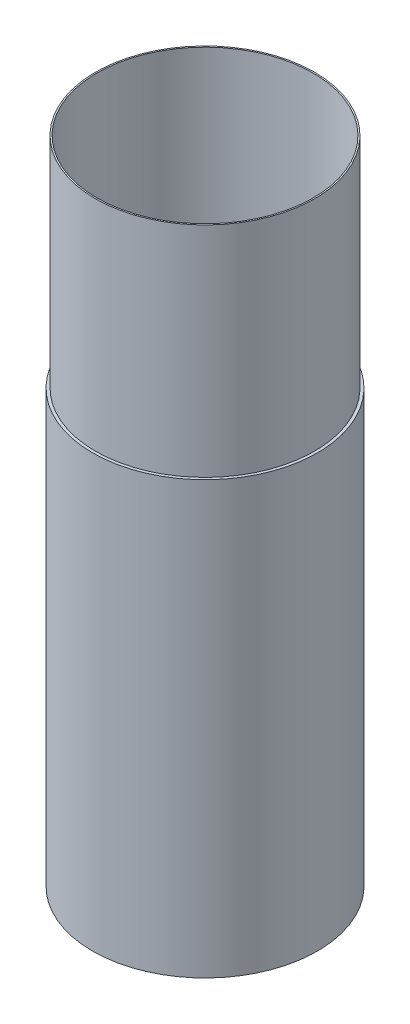
ISO-10303-21;
HEADER;
FILE_DESCRIPTION(('STEP AP214'),'2;1');
FILE_NAME('part.step','',(''),(''),'','','');
FILE_SCHEMA(('AUTOMOTIVE_DESIGN { 1 0 10303 214 1 1 1 1 }'));
ENDSEC;
DATA;
#1=APPLICATION_CONTEXT('core data for automotive mechanical design processes');
#2=APPLICATION_PROTOCOL_DEFINITION('international standard','automotive_design',2000,#1);
#3=PRODUCT_CONTEXT('',#1,'mechanical');
#4=PRODUCT('Part','Part','',(#3));
#5=PRODUCT_RELATED_PRODUCT_CATEGORY('part','',(#4));
#6=PRODUCT_DEFINITION_FORMATION('','',#4);
#7=PRODUCT_DEFINITION_CONTEXT('part definition',#1,'design');
#8=PRODUCT_DEFINITION('design','',#6,#7);
#9=PRODUCT_DEFINITION_SHAPE('','',#8);
#10=(LENGTH_UNIT() NAMED_UNIT(*) SI_UNIT(.MILLI.,.METRE.));
#11=(NAMED_UNIT(*) PLANE_ANGLE_UNIT() SI_UNIT($,.RADIAN.));
#12=(NAMED_UNIT(*) SI_UNIT($,.STERADIAN.) SOLID_ANGLE_UNIT());
#13=UNCERTAINTY_MEASURE_WITH_UNIT(LENGTH_MEASURE(1.E-05),#10,'distance_accuracy_value','');
#14=(GEOMETRIC_REPRESENTATION_CONTEXT(3) GLOBAL_UNCERTAINTY_ASSIGNED_CONTEXT((#13)) GLOBAL_UNIT_ASSIGNED_CONTEXT((#10,
#11,#12)) REPRESENTATION_CONTEXT('',''));
#15=CARTESIAN_POINT('',(0.,0.,0.));
#16=DIRECTION('',(0.,0.,1.));
#17=DIRECTION('',(1.,0.,0.));
#18=AXIS2_PLACEMENT_3D('',#15,#16,#17);
#19=CARTESIAN_POINT('',(0.,204.615384615384,0.));
#20=DIRECTION('',(0.,1.,0.));
#21=DIRECTION('',(0.,0.,1.));
#22=AXIS2_PLACEMENT_3D('',#19,#20,#21);
#23=CYLINDRICAL_SURFACE('',#22,76.2);
#24=CARTESIAN_POINT('',(0.,0.,0.));
#25=DIRECTION('',(0.,1.,0.));
#26=DIRECTION('',(0.,0.,1.));
#27=AXIS2_PLACEMENT_3D('',#24,#25,#26);
#28=CIRCLE('',#27,76.2);
#29=CARTESIAN_POINT('',(0.,0.,76.2));
#30=VERTEX_POINT('',#29);
#31=EDGE_CURVE('E51',#30,#30,#28,.T.);
#32=ORIENTED_EDGE('',*,*,#31,.F.);
#33=EDGE_LOOP('',(#32));
#34=FACE_BOUND('',#33,.T.);
#35=CARTESIAN_POINT('',(0.,148.,0.));
#36=DIRECTION('',(0.,1.,0.));
#37=DIRECTION('',(0.,0.,1.));
#38=AXIS2_PLACEMENT_3D('',#35,#36,#37);
#39=CIRCLE('',#38,76.2);
#40=CARTESIAN_POINT('',(0.,148.,76.2));
#41=VERTEX_POINT('',#40);
#42=EDGE_CURVE('E10',#41,#41,#39,.F.);
#43=ORIENTED_EDGE('',*,*,#42,.F.);
#44=EDGE_LOOP('',(#43));
#45=FACE_BOUND('',#44,.T.);
#46=ADVANCED_FACE('F31',(#34,#45),#23,.F.);
#47=CARTESIAN_POINT('',(76.2,0.,0.));
#48=DIRECTION('',(0.,1.,0.));
#49=DIRECTION('',(0.,0.,1.));
#50=AXIS2_PLACEMENT_3D('',#47,#48,#49);
#51=PLANE('',#50);
#52=CARTESIAN_POINT('',(0.,0.,0.));
#53=DIRECTION('',(0.,1.,0.));
#54=DIRECTION('',(0.,0.,1.));
#55=AXIS2_PLACEMENT_3D('',#52,#53,#54);
#56=CIRCLE('',#55,78.16);
#57=CARTESIAN_POINT('',(0.,0.,78.16));
#58=VERTEX_POINT('',#57);
#59=EDGE_CURVE('E38',#58,#58,#56,.T.);
#60=ORIENTED_EDGE('',*,*,#59,.F.);
#61=EDGE_LOOP('',(#60));
#62=FACE_BOUND('',#61,.T.);
#63=ORIENTED_EDGE('',*,*,#31,.T.);
#64=EDGE_LOOP('',(#63));
#65=FACE_BOUND('',#64,.T.);
#66=ADVANCED_FACE('F33',(#62,#65),#51,.F.);
#67=CARTESIAN_POINT('',(0.,204.615384615384,0.));
#68=DIRECTION('',(0.,1.,0.));
#69=DIRECTION('',(0.,0.,1.));
#70=AXIS2_PLACEMENT_3D('',#67,#68,#69);
#71=CYLINDRICAL_SURFACE('',#70,78.16);
#72=CARTESIAN_POINT('',(0.,300.,0.));
#73=DIRECTION('',(0.,1.,0.));
#74=DIRECTION('',(0.,0.,1.));
#75=AXIS2_PLACEMENT_3D('',#72,#73,#74);
#76=CIRCLE('',#75,78.16);
#77=CARTESIAN_POINT('',(0.,300.,78.16));
#78=VERTEX_POINT('',#77);
#79=EDGE_CURVE('E42',#78,#78,#76,.T.);
#80=ORIENTED_EDGE('',*,*,#79,.F.);
#81=EDGE_LOOP('',(#80));
#82=FACE_BOUND('',#81,.T.);
#83=ORIENTED_EDGE('',*,*,#59,.T.);
#84=EDGE_LOOP('',(#83));
#85=FACE_BOUND('',#84,.T.);
#86=ADVANCED_FACE('F82',(#82,#85),#71,.T.);
#87=CARTESIAN_POINT('',(78.16,300.,0.));
#88=DIRECTION('',(0.,-1.,0.));
#89=DIRECTION('',(0.,0.,-1.));
#90=AXIS2_PLACEMENT_3D('',#87,#88,#89);
#91=PLANE('',#90);
#92=CARTESIAN_POINT('',(0.,300.,0.));
#93=DIRECTION('',(0.,1.,0.));
#94=DIRECTION('',(0.,0.,1.));
#95=AXIS2_PLACEMENT_3D('',#92,#93,#94);
#96=CIRCLE('',#95,76.2);
#97=CARTESIAN_POINT('',(0.,300.,76.2));
#98=VERTEX_POINT('',#97);
#99=EDGE_CURVE('E46',#98,#98,#96,.T.);
#100=ORIENTED_EDGE('',*,*,#99,.F.);
#101=EDGE_LOOP('',(#100));
#102=FACE_BOUND('',#101,.T.);
#103=ORIENTED_EDGE('',*,*,#79,.T.);
#104=EDGE_LOOP('',(#103));
#105=FACE_BOUND('',#104,.T.);
#106=ADVANCED_FACE('F90',(#102,#105),#91,.F.);
#107=CARTESIAN_POINT('',(0.,148.,0.));
#108=DIRECTION('',(0.,1.,0.));
#109=DIRECTION('',(0.,0.,1.));
#110=AXIS2_PLACEMENT_3D('',#107,#108,#109);
#111=CYLINDRICAL_SURFACE('',#110,76.2);
#112=CARTESIAN_POINT('',(0.,452.,0.));
#113=DIRECTION('',(0.,1.,0.));
#114=DIRECTION('',(0.,0.,1.));
#115=AXIS2_PLACEMENT_3D('',#112,#113,#114);
#116=CIRCLE('',#115,76.2);
#117=CARTESIAN_POINT('',(0.,452.,76.2));
#118=VERTEX_POINT('',#117);
#119=EDGE_CURVE('E57',#118,#118,#116,.T.);
#120=ORIENTED_EDGE('',*,*,#119,.F.);
#121=EDGE_LOOP('',(#120));
#122=FACE_BOUND('',#121,.T.);
#123=ORIENTED_EDGE('',*,*,#99,.T.);
#124=EDGE_LOOP('',(#123));
#125=FACE_BOUND('',#124,.T.);
#126=ADVANCED_FACE('F88',(#122,#125),#111,.T.);
#127=CARTESIAN_POINT('',(0.,148.,0.));
#128=DIRECTION('',(0.,1.,0.));
#129=DIRECTION('',(0.,0.,1.));
#130=AXIS2_PLACEMENT_3D('',#127,#128,#129);
#131=PLANE('',#130);
#132=CARTESIAN_POINT('',(0.,148.,0.));
#133=DIRECTION('',(0.,1.,0.));
#134=DIRECTION('',(0.,0.,1.));
#135=AXIS2_PLACEMENT_3D('',#132,#133,#134);
#136=CIRCLE('',#135,75.2);
#137=CARTESIAN_POINT('',(0.,148.,75.2));
#138=VERTEX_POINT('',#137);
#139=EDGE_CURVE('E54',#138,#138,#136,.T.);
#140=ORIENTED_EDGE('',*,*,#139,.T.);
#141=EDGE_LOOP('',(#140));
#142=FACE_BOUND('',#141,.T.);
#143=ORIENTED_EDGE('',*,*,#42,.T.);
#144=EDGE_LOOP('',(#143));
#145=FACE_BOUND('',#144,.T.);
#146=ADVANCED_FACE('F73',(#142,#145),#131,.F.);
#147=CARTESIAN_POINT('',(0.,148.,0.));
#148=DIRECTION('',(0.,1.,0.));
#149=DIRECTION('',(0.,0.,1.));
#150=AXIS2_PLACEMENT_3D('',#147,#148,#149);
#151=CYLINDRICAL_SURFACE('',#150,75.2);
#152=ORIENTED_EDGE('',*,*,#139,.F.);
#153=EDGE_LOOP('',(#152));
#154=FACE_BOUND('',#153,.T.);
#155=CARTESIAN_POINT('',(0.,452.,0.));
#156=DIRECTION('',(0.,1.,0.));
#157=DIRECTION('',(0.,0.,1.));
#158=AXIS2_PLACEMENT_3D('',#155,#156,#157);
#159=CIRCLE('',#158,75.2);
#160=CARTESIAN_POINT('',(0.,452.,75.2));
#161=VERTEX_POINT('',#160);
#162=EDGE_CURVE('E60',#161,#161,#159,.T.);
#163=ORIENTED_EDGE('',*,*,#162,.T.);
#164=EDGE_LOOP('',(#163));
#165=FACE_BOUND('',#164,.T.);
#166=ADVANCED_FACE('F64',(#154,#165),#151,.F.);
#167=CARTESIAN_POINT('',(0.,452.,0.));
#168=DIRECTION('',(0.,1.,0.));
#169=DIRECTION('',(0.,0.,1.));
#170=AXIS2_PLACEMENT_3D('',#167,#168,#169);
#171=PLANE('',#170);
#172=ORIENTED_EDGE('',*,*,#119,.T.);
#173=EDGE_LOOP('',(#172));
#174=FACE_BOUND('',#173,.T.);
#175=ORIENTED_EDGE('',*,*,#162,.F.);
#176=EDGE_LOOP('',(#175));
#177=FACE_BOUND('',#176,.T.);
#178=ADVANCED_FACE('F66',(#174,#177),#171,.T.);
#179=CLOSED_SHELL('',(#46,#66,#86,#106,#126,#146,#166,#178));
#180=MANIFOLD_SOLID_BREP('B2',#179);
#181=ADVANCED_BREP_SHAPE_REPRESENTATION('',(#18,#180),#14);
#182=SHAPE_DEFINITION_REPRESENTATION(#9,#181);
ENDSEC;
END-ISO-10303-21;
